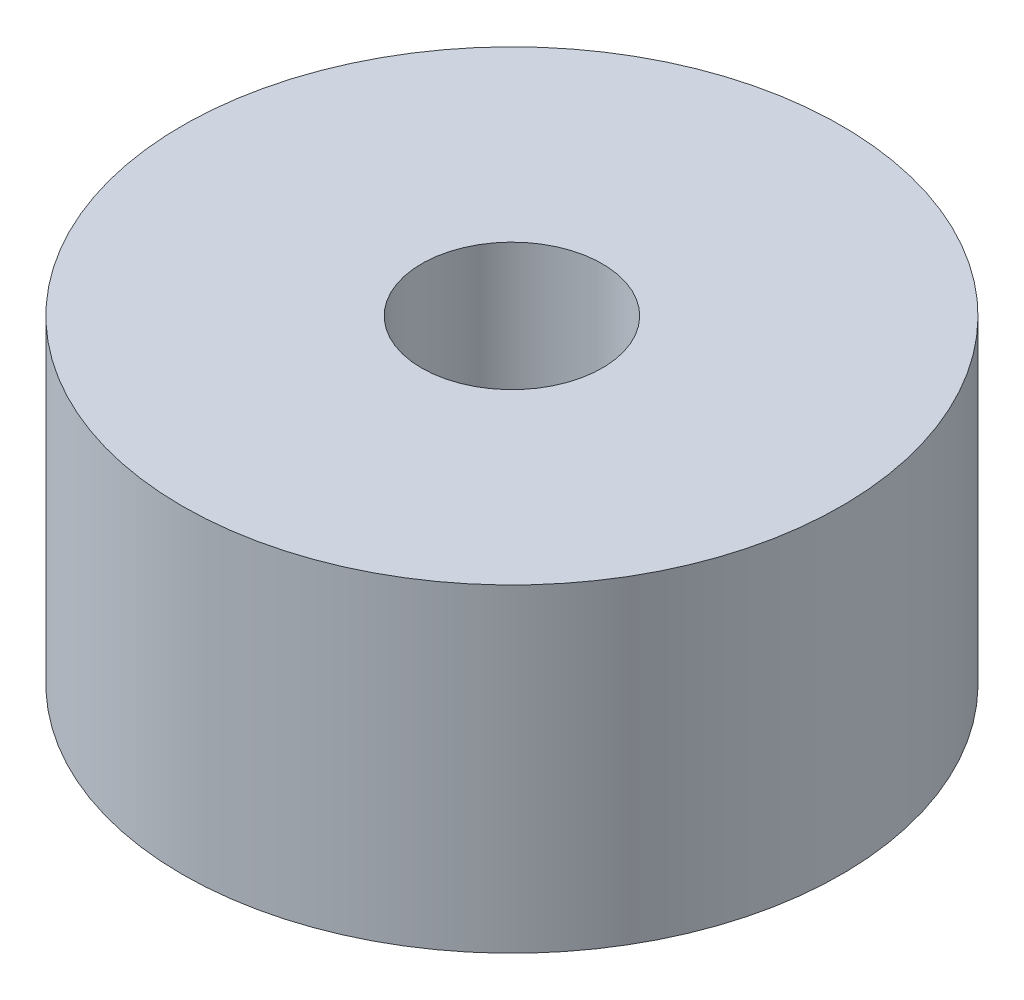
ISO-10303-21;
HEADER;
FILE_DESCRIPTION(('STEP AP214'),'2;1');
FILE_NAME('part.step','',(''),(''),'','','');
FILE_SCHEMA(('AUTOMOTIVE_DESIGN { 1 0 10303 214 1 1 1 1 }'));
ENDSEC;
DATA;
#1=APPLICATION_CONTEXT('core data for automotive mechanical design processes');
#2=APPLICATION_PROTOCOL_DEFINITION('international standard','automotive_design',2000,#1);
#3=PRODUCT_CONTEXT('',#1,'mechanical');
#4=PRODUCT('Part','Part','',(#3));
#5=PRODUCT_RELATED_PRODUCT_CATEGORY('part','',(#4));
#6=PRODUCT_DEFINITION_FORMATION('','',#4);
#7=PRODUCT_DEFINITION_CONTEXT('part definition',#1,'design');
#8=PRODUCT_DEFINITION('design','',#6,#7);
#9=PRODUCT_DEFINITION_SHAPE('','',#8);
#10=(LENGTH_UNIT() NAMED_UNIT(*) SI_UNIT(.MILLI.,.METRE.));
#11=(NAMED_UNIT(*) PLANE_ANGLE_UNIT() SI_UNIT($,.RADIAN.));
#12=(NAMED_UNIT(*) SI_UNIT($,.STERADIAN.) SOLID_ANGLE_UNIT());
#13=UNCERTAINTY_MEASURE_WITH_UNIT(LENGTH_MEASURE(1.E-05),#10,'distance_accuracy_value','');
#14=(GEOMETRIC_REPRESENTATION_CONTEXT(3) GLOBAL_UNCERTAINTY_ASSIGNED_CONTEXT((#13)) GLOBAL_UNIT_ASSIGNED_CONTEXT((#10,
#11,#12)) REPRESENTATION_CONTEXT('',''));
#15=CARTESIAN_POINT('',(0.,0.,0.));
#16=DIRECTION('',(0.,0.,1.));
#17=DIRECTION('',(1.,0.,0.));
#18=AXIS2_PLACEMENT_3D('',#15,#16,#17);
#19=CARTESIAN_POINT('',(0.,15.,0.));
#20=DIRECTION('',(0.,1.,0.));
#21=DIRECTION('',(0.,0.,1.));
#22=AXIS2_PLACEMENT_3D('',#19,#20,#21);
#23=PLANE('',#22);
#24=CARTESIAN_POINT('',(0.,15.,0.));
#25=DIRECTION('',(0.,1.,0.));
#26=DIRECTION('',(0.,0.,1.));
#27=AXIS2_PLACEMENT_3D('',#24,#25,#26);
#28=CIRCLE('',#27,15.5);
#29=CARTESIAN_POINT('',(0.,15.,15.5));
#30=VERTEX_POINT('',#29);
#31=EDGE_CURVE('E10',#30,#30,#28,.T.);
#32=ORIENTED_EDGE('',*,*,#31,.T.);
#33=EDGE_LOOP('',(#32));
#34=FACE_BOUND('',#33,.T.);
#35=CARTESIAN_POINT('',(0.,15.,0.));
#36=DIRECTION('',(0.,1.,0.));
#37=DIRECTION('',(0.,0.,1.));
#38=AXIS2_PLACEMENT_3D('',#35,#36,#37);
#39=CIRCLE('',#38,4.25);
#40=CARTESIAN_POINT('',(0.,15.,4.25));
#41=VERTEX_POINT('',#40);
#42=EDGE_CURVE('E50',#41,#41,#39,.T.);
#43=ORIENTED_EDGE('',*,*,#42,.F.);
#44=EDGE_LOOP('',(#43));
#45=FACE_BOUND('',#44,.T.);
#46=ADVANCED_FACE('F37',(#34,#45),#23,.T.);
#47=CARTESIAN_POINT('',(0.,0.,0.));
#48=DIRECTION('',(0.,1.,0.));
#49=DIRECTION('',(0.,0.,1.));
#50=AXIS2_PLACEMENT_3D('',#47,#48,#49);
#51=PLANE('',#50);
#52=CARTESIAN_POINT('',(0.,0.,0.));
#53=DIRECTION('',(0.,1.,0.));
#54=DIRECTION('',(0.,0.,1.));
#55=AXIS2_PLACEMENT_3D('',#52,#53,#54);
#56=CIRCLE('',#55,15.5);
#57=CARTESIAN_POINT('',(0.,0.,15.5));
#58=VERTEX_POINT('',#57);
#59=EDGE_CURVE('E41',#58,#58,#56,.T.);
#60=ORIENTED_EDGE('',*,*,#59,.F.);
#61=EDGE_LOOP('',(#60));
#62=FACE_BOUND('',#61,.T.);
#63=CARTESIAN_POINT('',(0.,0.,0.));
#64=DIRECTION('',(0.,1.,0.));
#65=DIRECTION('',(0.,0.,1.));
#66=AXIS2_PLACEMENT_3D('',#63,#64,#65);
#67=CIRCLE('',#66,4.25);
#68=CARTESIAN_POINT('',(0.,0.,4.25));
#69=VERTEX_POINT('',#68);
#70=EDGE_CURVE('E52',#69,#69,#67,.T.);
#71=ORIENTED_EDGE('',*,*,#70,.T.);
#72=EDGE_LOOP('',(#71));
#73=FACE_BOUND('',#72,.T.);
#74=ADVANCED_FACE('F64',(#62,#73),#51,.F.);
#75=CARTESIAN_POINT('',(0.,15.,0.));
#76=DIRECTION('',(0.,-1.,0.));
#77=DIRECTION('',(0.,0.,-1.));
#78=AXIS2_PLACEMENT_3D('',#75,#76,#77);
#79=CYLINDRICAL_SURFACE('',#78,15.5);
#80=ORIENTED_EDGE('',*,*,#31,.F.);
#81=EDGE_LOOP('',(#80));
#82=FACE_BOUND('',#81,.T.);
#83=ORIENTED_EDGE('',*,*,#59,.T.);
#84=EDGE_LOOP('',(#83));
#85=FACE_BOUND('',#84,.T.);
#86=ADVANCED_FACE('F39',(#82,#85),#79,.T.);
#87=CARTESIAN_POINT('',(0.,15.,0.));
#88=DIRECTION('',(0.,-1.,0.));
#89=DIRECTION('',(0.,0.,-1.));
#90=AXIS2_PLACEMENT_3D('',#87,#88,#89);
#91=CYLINDRICAL_SURFACE('',#90,4.25);
#92=ORIENTED_EDGE('',*,*,#42,.T.);
#93=EDGE_LOOP('',(#92));
#94=FACE_BOUND('',#93,.T.);
#95=ORIENTED_EDGE('',*,*,#70,.F.);
#96=EDGE_LOOP('',(#95));
#97=FACE_BOUND('',#96,.T.);
#98=ADVANCED_FACE('F60',(#94,#97),#91,.F.);
#99=CLOSED_SHELL('',(#46,#74,#86,#98));
#100=MANIFOLD_SOLID_BREP('B2',#99);
#101=ADVANCED_BREP_SHAPE_REPRESENTATION('',(#18,#100),#14);
#102=SHAPE_DEFINITION_REPRESENTATION(#9,#101);
ENDSEC;
END-ISO-10303-21;
